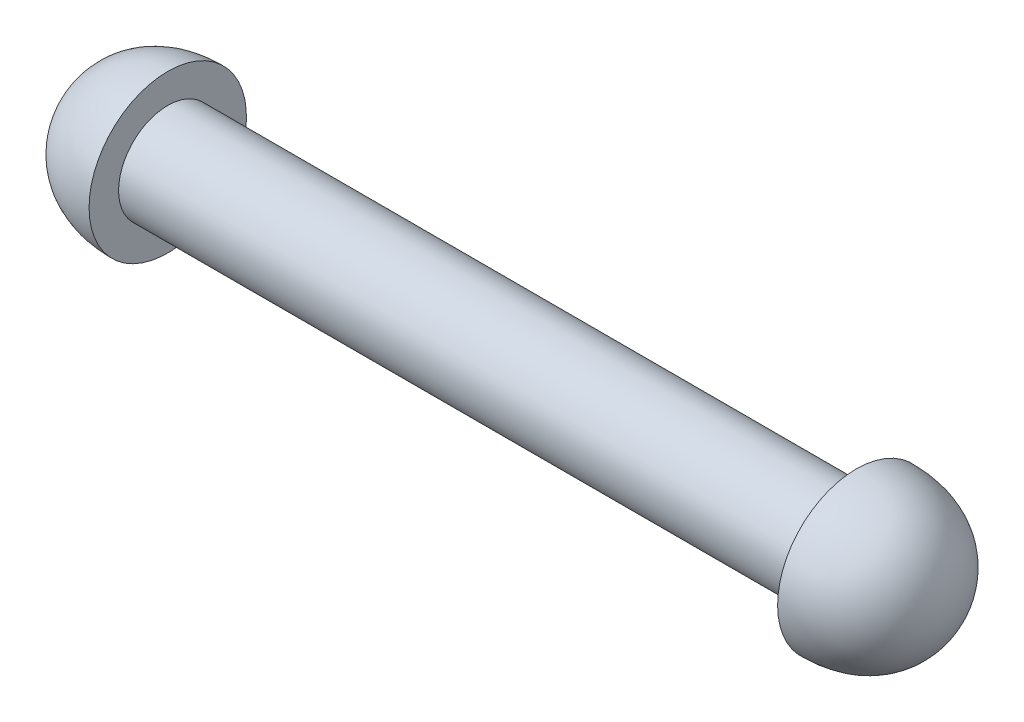
ISO-10303-21;
HEADER;
FILE_DESCRIPTION(('STEP AP214'),'2;1');
FILE_NAME('part.step','',(''),(''),'','','');
FILE_SCHEMA(('AUTOMOTIVE_DESIGN { 1 0 10303 214 1 1 1 1 }'));
ENDSEC;
DATA;
#1=APPLICATION_CONTEXT('core data for automotive mechanical design processes');
#2=APPLICATION_PROTOCOL_DEFINITION('international standard','automotive_design',2000,#1);
#3=PRODUCT_CONTEXT('',#1,'mechanical');
#4=PRODUCT('Part','Part','',(#3));
#5=PRODUCT_RELATED_PRODUCT_CATEGORY('part','',(#4));
#6=PRODUCT_DEFINITION_FORMATION('','',#4);
#7=PRODUCT_DEFINITION_CONTEXT('part definition',#1,'design');
#8=PRODUCT_DEFINITION('design','',#6,#7);
#9=PRODUCT_DEFINITION_SHAPE('','',#8);
#10=(LENGTH_UNIT() NAMED_UNIT(*) SI_UNIT(.MILLI.,.METRE.));
#11=(NAMED_UNIT(*) PLANE_ANGLE_UNIT() SI_UNIT($,.RADIAN.));
#12=(NAMED_UNIT(*) SI_UNIT($,.STERADIAN.) SOLID_ANGLE_UNIT());
#13=UNCERTAINTY_MEASURE_WITH_UNIT(LENGTH_MEASURE(1.E-05),#10,'distance_accuracy_value','');
#14=(GEOMETRIC_REPRESENTATION_CONTEXT(3) GLOBAL_UNCERTAINTY_ASSIGNED_CONTEXT((#13)) GLOBAL_UNIT_ASSIGNED_CONTEXT((#10,
#11,#12)) REPRESENTATION_CONTEXT('',''));
#15=CARTESIAN_POINT('',(0.,0.,0.));
#16=DIRECTION('',(0.,0.,1.));
#17=DIRECTION('',(1.,0.,0.));
#18=AXIS2_PLACEMENT_3D('',#15,#16,#17);
#19=CARTESIAN_POINT('',(175.,0.,0.));
#20=DIRECTION('',(-1.,0.,0.));
#21=DIRECTION('',(0.,0.,1.));
#22=AXIS2_PLACEMENT_3D('',#19,#20,#21);
#23=CYLINDRICAL_SURFACE('',#22,25.);
#24=CARTESIAN_POINT('',(0.,0.,0.));
#25=DIRECTION('',(-1.,0.,0.));
#26=DIRECTION('',(0.,0.,1.));
#27=AXIS2_PLACEMENT_3D('',#24,#25,#26);
#28=CIRCLE('',#27,25.);
#29=CARTESIAN_POINT('',(0.,0.,25.));
#30=VERTEX_POINT('',#29);
#31=EDGE_CURVE('E11',#30,#30,#28,.T.);
#32=ORIENTED_EDGE('',*,*,#31,.F.);
#33=EDGE_LOOP('',(#32));
#34=FACE_BOUND('',#33,.T.);
#35=CARTESIAN_POINT('',(350.,0.,0.));
#36=DIRECTION('',(1.,0.,0.));
#37=DIRECTION('',(0.,0.,-1.));
#38=AXIS2_PLACEMENT_3D('',#35,#36,#37);
#39=CIRCLE('',#38,25.);
#40=CARTESIAN_POINT('',(350.,0.,-25.));
#41=VERTEX_POINT('',#40);
#42=EDGE_CURVE('E64',#41,#41,#39,.T.);
#43=ORIENTED_EDGE('',*,*,#42,.F.);
#44=EDGE_LOOP('',(#43));
#45=FACE_BOUND('',#44,.T.);
#46=ADVANCED_FACE('F39',(#34,#45),#23,.T.);
#47=CARTESIAN_POINT('',(0.,40.,0.));
#48=CARTESIAN_POINT('',(-30.9912388312532,40.,0.));
#49=CARTESIAN_POINT('',(-45.4583925127281,20.1837818553006,0.));
#50=CARTESIAN_POINT('',(-45.4583925127281,0.,0.));
#51=B_SPLINE_CURVE_WITH_KNOTS('',3,(#47,#48,#49,#50),.UNSPECIFIED.,.F.,.F.,(4,4),(0.,1.),.UNSPECIFIED.);
#52=CARTESIAN_POINT('',(-100.078673333577,0.,0.));
#53=DIRECTION('',(-1.,0.,0.));
#54=AXIS1_PLACEMENT('',#52,#53);
#55=SURFACE_OF_REVOLUTION('',#51,#54);
#56=CARTESIAN_POINT('',(-45.4583925127281,0.,0.));
#57=VERTEX_POINT('',#56);
#58=VERTEX_LOOP('',#57);
#59=FACE_BOUND('',#58,.T.);
#60=CARTESIAN_POINT('',(0.,0.,0.));
#61=DIRECTION('',(-1.,0.,0.));
#62=DIRECTION('',(0.,0.,1.));
#63=AXIS2_PLACEMENT_3D('',#60,#61,#62);
#64=CIRCLE('',#63,40.);
#65=CARTESIAN_POINT('',(0.,0.,40.));
#66=VERTEX_POINT('',#65);
#67=EDGE_CURVE('E47',#66,#66,#64,.T.);
#68=ORIENTED_EDGE('',*,*,#67,.T.);
#69=EDGE_LOOP('',(#68));
#70=FACE_BOUND('',#69,.T.);
#71=ADVANCED_FACE('F80',(#59,#70),#55,.T.);
#72=CARTESIAN_POINT('',(0.,40.,0.));
#73=DIRECTION('',(-1.,0.,0.));
#74=DIRECTION('',(0.,0.,1.));
#75=AXIS2_PLACEMENT_3D('',#72,#73,#74);
#76=PLANE('',#75);
#77=ORIENTED_EDGE('',*,*,#31,.T.);
#78=EDGE_LOOP('',(#77));
#79=FACE_BOUND('',#78,.T.);
#80=ORIENTED_EDGE('',*,*,#67,.F.);
#81=EDGE_LOOP('',(#80));
#82=FACE_BOUND('',#81,.T.);
#83=ADVANCED_FACE('F57',(#79,#82),#76,.F.);
#84=CARTESIAN_POINT('',(350.,40.,0.));
#85=CARTESIAN_POINT('',(380.991238831253,40.,0.));
#86=CARTESIAN_POINT('',(395.458392512728,20.1837818553006,0.));
#87=CARTESIAN_POINT('',(395.458392512728,0.,0.));
#88=B_SPLINE_CURVE_WITH_KNOTS('',3,(#84,#85,#86,#87),.UNSPECIFIED.,.F.,.F.,(4,4),(0.,1.),.UNSPECIFIED.);
#89=CARTESIAN_POINT('',(450.078673333577,0.,0.));
#90=DIRECTION('',(1.,0.,0.));
#91=AXIS1_PLACEMENT('',#89,#90);
#92=SURFACE_OF_REVOLUTION('',#88,#91);
#93=CARTESIAN_POINT('',(395.458392512728,0.,0.));
#94=VERTEX_POINT('',#93);
#95=VERTEX_LOOP('',#94);
#96=FACE_BOUND('',#95,.T.);
#97=CARTESIAN_POINT('',(350.,0.,0.));
#98=DIRECTION('',(-1.,0.,0.));
#99=DIRECTION('',(0.,0.,1.));
#100=AXIS2_PLACEMENT_3D('',#97,#98,#99);
#101=CIRCLE('',#100,40.);
#102=CARTESIAN_POINT('',(350.,0.,40.));
#103=VERTEX_POINT('',#102);
#104=EDGE_CURVE('E61',#103,#103,#101,.T.);
#105=ORIENTED_EDGE('',*,*,#104,.F.);
#106=EDGE_LOOP('',(#105));
#107=FACE_BOUND('',#106,.T.);
#108=ADVANCED_FACE('F53',(#96,#107),#92,.T.);
#109=CARTESIAN_POINT('',(350.,40.,0.));
#110=DIRECTION('',(1.,0.,0.));
#111=DIRECTION('',(0.,0.,1.));
#112=AXIS2_PLACEMENT_3D('',#109,#110,#111);
#113=PLANE('',#112);
#114=ORIENTED_EDGE('',*,*,#42,.T.);
#115=EDGE_LOOP('',(#114));
#116=FACE_BOUND('',#115,.T.);
#117=ORIENTED_EDGE('',*,*,#104,.T.);
#118=EDGE_LOOP('',(#117));
#119=FACE_BOUND('',#118,.T.);
#120=ADVANCED_FACE('F56',(#116,#119),#113,.F.);
#121=CLOSED_SHELL('',(#46,#71,#83,#108,#120));
#122=MANIFOLD_SOLID_BREP('B2',#121);
#123=ADVANCED_BREP_SHAPE_REPRESENTATION('',(#18,#122),#14);
#124=SHAPE_DEFINITION_REPRESENTATION(#9,#123);
ENDSEC;
END-ISO-10303-21;
